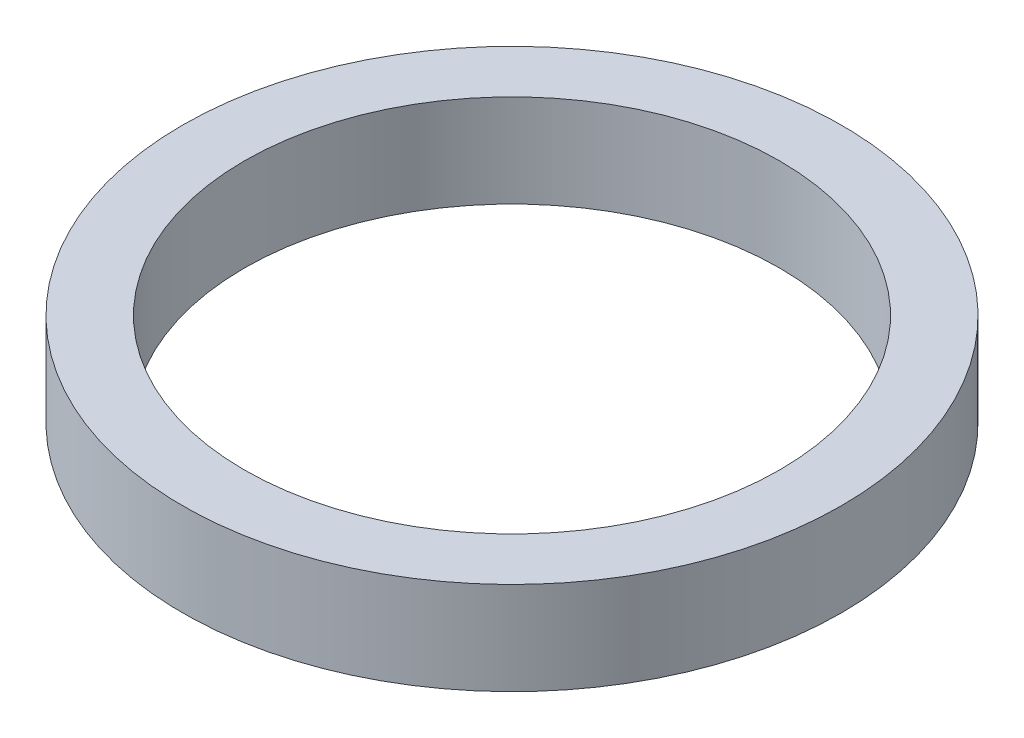
ISO-10303-21;
HEADER;
FILE_DESCRIPTION(('STEP AP214'),'2;1');
FILE_NAME('part.step','',(''),(''),'','','');
FILE_SCHEMA(('AUTOMOTIVE_DESIGN { 1 0 10303 214 1 1 1 1 }'));
ENDSEC;
DATA;
#1=APPLICATION_CONTEXT('core data for automotive mechanical design processes');
#2=APPLICATION_PROTOCOL_DEFINITION('international standard','automotive_design',2000,#1);
#3=PRODUCT_CONTEXT('',#1,'mechanical');
#4=PRODUCT('Part','Part','',(#3));
#5=PRODUCT_RELATED_PRODUCT_CATEGORY('part','',(#4));
#6=PRODUCT_DEFINITION_FORMATION('','',#4);
#7=PRODUCT_DEFINITION_CONTEXT('part definition',#1,'design');
#8=PRODUCT_DEFINITION('design','',#6,#7);
#9=PRODUCT_DEFINITION_SHAPE('','',#8);
#10=(LENGTH_UNIT() NAMED_UNIT(*) SI_UNIT(.MILLI.,.METRE.));
#11=(NAMED_UNIT(*) PLANE_ANGLE_UNIT() SI_UNIT($,.RADIAN.));
#12=(NAMED_UNIT(*) SI_UNIT($,.STERADIAN.) SOLID_ANGLE_UNIT());
#13=UNCERTAINTY_MEASURE_WITH_UNIT(LENGTH_MEASURE(1.E-05),#10,'distance_accuracy_value','');
#14=(GEOMETRIC_REPRESENTATION_CONTEXT(3) GLOBAL_UNCERTAINTY_ASSIGNED_CONTEXT((#13)) GLOBAL_UNIT_ASSIGNED_CONTEXT((#10,
#11,#12)) REPRESENTATION_CONTEXT('',''));
#15=CARTESIAN_POINT('',(0.,0.,0.));
#16=DIRECTION('',(0.,0.,1.));
#17=DIRECTION('',(1.,0.,0.));
#18=AXIS2_PLACEMENT_3D('',#15,#16,#17);
#19=CARTESIAN_POINT('',(-106.5,30.,0.));
#20=DIRECTION('',(0.,1.,0.));
#21=DIRECTION('',(-1.,0.,0.));
#22=AXIS2_PLACEMENT_3D('',#19,#20,#21);
#23=PLANE('',#22);
#24=CARTESIAN_POINT('',(0.,30.,0.));
#25=DIRECTION('',(0.,1.,0.));
#26=DIRECTION('',(-1.,0.,0.));
#27=AXIS2_PLACEMENT_3D('',#24,#25,#26);
#28=CIRCLE('',#27,106.5);
#29=CARTESIAN_POINT('',(-106.5,30.,0.));
#30=VERTEX_POINT('',#29);
#31=EDGE_CURVE('E43',#30,#30,#28,.T.);
#32=ORIENTED_EDGE('',*,*,#31,.T.);
#33=EDGE_LOOP('',(#32));
#34=FACE_BOUND('',#33,.T.);
#35=CARTESIAN_POINT('',(0.,30.,0.));
#36=DIRECTION('',(0.,1.,0.));
#37=DIRECTION('',(-1.,0.,0.));
#38=AXIS2_PLACEMENT_3D('',#35,#36,#37);
#39=CIRCLE('',#38,86.5);
#40=CARTESIAN_POINT('',(-86.5000000000001,30.,0.));
#41=VERTEX_POINT('',#40);
#42=EDGE_CURVE('E10',#41,#41,#39,.T.);
#43=ORIENTED_EDGE('',*,*,#42,.F.);
#44=EDGE_LOOP('',(#43));
#45=FACE_BOUND('',#44,.T.);
#46=ADVANCED_FACE('F29',(#34,#45),#23,.T.);
#47=CARTESIAN_POINT('',(0.,10.,0.));
#48=DIRECTION('',(0.,1.,0.));
#49=DIRECTION('',(-1.,0.,0.));
#50=AXIS2_PLACEMENT_3D('',#47,#48,#49);
#51=CYLINDRICAL_SURFACE('',#50,86.5);
#52=ORIENTED_EDGE('',*,*,#42,.T.);
#53=EDGE_LOOP('',(#52));
#54=FACE_BOUND('',#53,.T.);
#55=CARTESIAN_POINT('',(0.,0.,0.));
#56=DIRECTION('',(0.,1.,0.));
#57=DIRECTION('',(-1.,0.,0.));
#58=AXIS2_PLACEMENT_3D('',#55,#56,#57);
#59=CIRCLE('',#58,86.5);
#60=CARTESIAN_POINT('',(-86.5000000000001,0.,0.));
#61=VERTEX_POINT('',#60);
#62=EDGE_CURVE('E35',#61,#61,#59,.T.);
#63=ORIENTED_EDGE('',*,*,#62,.F.);
#64=EDGE_LOOP('',(#63));
#65=FACE_BOUND('',#64,.T.);
#66=ADVANCED_FACE('F59',(#54,#65),#51,.F.);
#67=CARTESIAN_POINT('',(-106.5,0.,0.));
#68=DIRECTION('',(0.,-1.,0.));
#69=DIRECTION('',(1.,0.,0.));
#70=AXIS2_PLACEMENT_3D('',#67,#68,#69);
#71=PLANE('',#70);
#72=ORIENTED_EDGE('',*,*,#62,.T.);
#73=EDGE_LOOP('',(#72));
#74=FACE_BOUND('',#73,.T.);
#75=CARTESIAN_POINT('',(0.,0.,0.));
#76=DIRECTION('',(0.,1.,0.));
#77=DIRECTION('',(-1.,0.,0.));
#78=AXIS2_PLACEMENT_3D('',#75,#76,#77);
#79=CIRCLE('',#78,106.5);
#80=CARTESIAN_POINT('',(-106.5,0.,0.));
#81=VERTEX_POINT('',#80);
#82=EDGE_CURVE('E39',#81,#81,#79,.T.);
#83=ORIENTED_EDGE('',*,*,#82,.F.);
#84=EDGE_LOOP('',(#83));
#85=FACE_BOUND('',#84,.T.);
#86=ADVANCED_FACE('F53',(#74,#85),#71,.T.);
#87=CARTESIAN_POINT('',(0.,10.,0.));
#88=DIRECTION('',(0.,1.,0.));
#89=DIRECTION('',(-1.,0.,0.));
#90=AXIS2_PLACEMENT_3D('',#87,#88,#89);
#91=CYLINDRICAL_SURFACE('',#90,106.5);
#92=ORIENTED_EDGE('',*,*,#82,.T.);
#93=EDGE_LOOP('',(#92));
#94=FACE_BOUND('',#93,.T.);
#95=ORIENTED_EDGE('',*,*,#31,.F.);
#96=EDGE_LOOP('',(#95));
#97=FACE_BOUND('',#96,.T.);
#98=ADVANCED_FACE('F51',(#94,#97),#91,.T.);
#99=CLOSED_SHELL('',(#46,#66,#86,#98));
#100=MANIFOLD_SOLID_BREP('B2',#99);
#101=ADVANCED_BREP_SHAPE_REPRESENTATION('',(#18,#100),#14);
#102=SHAPE_DEFINITION_REPRESENTATION(#9,#101);
ENDSEC;
END-ISO-10303-21;
